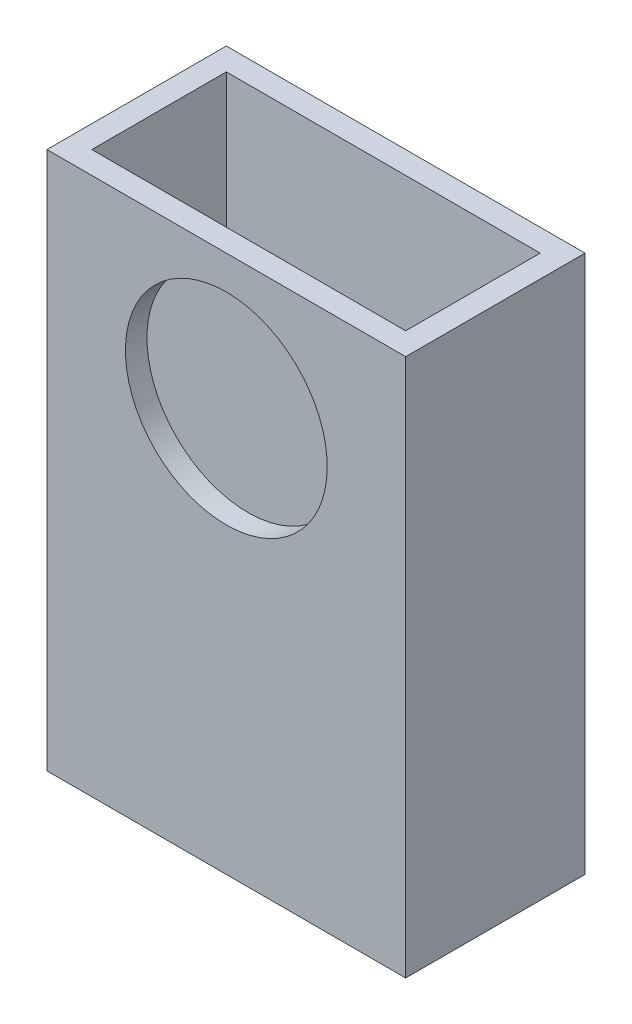
ISO-10303-21;
HEADER;
FILE_DESCRIPTION(('STEP AP214'),'2;1');
FILE_NAME('part.step','',(''),(''),'','','');
FILE_SCHEMA(('AUTOMOTIVE_DESIGN { 1 0 10303 214 1 1 1 1 }'));
ENDSEC;
DATA;
#1=APPLICATION_CONTEXT('core data for automotive mechanical design processes');
#2=APPLICATION_PROTOCOL_DEFINITION('international standard','automotive_design',2000,#1);
#3=PRODUCT_CONTEXT('',#1,'mechanical');
#4=PRODUCT('Part','Part','',(#3));
#5=PRODUCT_RELATED_PRODUCT_CATEGORY('part','',(#4));
#6=PRODUCT_DEFINITION_FORMATION('','',#4);
#7=PRODUCT_DEFINITION_CONTEXT('part definition',#1,'design');
#8=PRODUCT_DEFINITION('design','',#6,#7);
#9=PRODUCT_DEFINITION_SHAPE('','',#8);
#10=(LENGTH_UNIT() NAMED_UNIT(*) SI_UNIT(.MILLI.,.METRE.));
#11=(NAMED_UNIT(*) PLANE_ANGLE_UNIT() SI_UNIT($,.RADIAN.));
#12=(NAMED_UNIT(*) SI_UNIT($,.STERADIAN.) SOLID_ANGLE_UNIT());
#13=UNCERTAINTY_MEASURE_WITH_UNIT(LENGTH_MEASURE(1.E-05),#10,'distance_accuracy_value','');
#14=(GEOMETRIC_REPRESENTATION_CONTEXT(3) GLOBAL_UNCERTAINTY_ASSIGNED_CONTEXT((#13)) GLOBAL_UNIT_ASSIGNED_CONTEXT((#10,
#11,#12)) REPRESENTATION_CONTEXT('',''));
#15=CARTESIAN_POINT('',(0.,0.,0.));
#16=DIRECTION('',(0.,0.,1.));
#17=DIRECTION('',(1.,0.,0.));
#18=AXIS2_PLACEMENT_3D('',#15,#16,#17);
#19=CARTESIAN_POINT('',(0.,0.,25.4));
#20=DIRECTION('',(1.,0.,0.));
#21=DIRECTION('',(0.,1.,0.));
#22=AXIS2_PLACEMENT_3D('',#19,#20,#21);
#23=PLANE('',#22);
#24=DIRECTION('',(0.,-1.,0.));
#25=VECTOR('',#24,1.);
#26=CARTESIAN_POINT('',(0.,0.,0.));
#27=LINE('',#26,#25);
#28=CARTESIAN_POINT('',(0.,76.2,0.));
#29=VERTEX_POINT('',#28);
#30=CARTESIAN_POINT('',(0.,0.,0.));
#31=VERTEX_POINT('',#30);
#32=EDGE_CURVE('E151',#29,#31,#27,.T.);
#33=ORIENTED_EDGE('',*,*,#32,.T.);
#34=DIRECTION('',(0.,0.,-1.));
#35=VECTOR('',#34,1.);
#36=CARTESIAN_POINT('',(0.,0.,25.4));
#37=LINE('',#36,#35);
#38=CARTESIAN_POINT('',(0.,0.,25.4));
#39=VERTEX_POINT('',#38);
#40=EDGE_CURVE('E11',#39,#31,#37,.T.);
#41=ORIENTED_EDGE('',*,*,#40,.F.);
#42=DIRECTION('',(0.,-1.,0.));
#43=VECTOR('',#42,1.);
#44=CARTESIAN_POINT('',(0.,0.,25.4));
#45=LINE('',#44,#43);
#46=CARTESIAN_POINT('',(0.,76.2,25.4));
#47=VERTEX_POINT('',#46);
#48=EDGE_CURVE('E157',#47,#39,#45,.T.);
#49=ORIENTED_EDGE('',*,*,#48,.F.);
#50=DIRECTION('',(0.,0.,-1.));
#51=VECTOR('',#50,1.);
#52=CARTESIAN_POINT('',(0.,76.2,25.4));
#53=LINE('',#52,#51);
#54=EDGE_CURVE('E171',#47,#29,#53,.T.);
#55=ORIENTED_EDGE('',*,*,#54,.T.);
#56=EDGE_LOOP('',(#33,#41,#49,#55));
#57=FACE_BOUND('',#56,.T.);
#58=ADVANCED_FACE('F39',(#57),#23,.F.);
#59=CARTESIAN_POINT('',(0.,0.,25.4));
#60=DIRECTION('',(0.,1.,0.));
#61=DIRECTION('',(0.,0.,1.));
#62=AXIS2_PLACEMENT_3D('',#59,#60,#61);
#63=PLANE('',#62);
#64=DIRECTION('',(1.,0.,0.));
#65=VECTOR('',#64,1.);
#66=CARTESIAN_POINT('',(3.175,0.,3.175));
#67=LINE('',#66,#65);
#68=CARTESIAN_POINT('',(3.175,0.,3.175));
#69=VERTEX_POINT('',#68);
#70=CARTESIAN_POINT('',(47.625,0.,3.175));
#71=VERTEX_POINT('',#70);
#72=EDGE_CURVE('E141',#69,#71,#67,.T.);
#73=ORIENTED_EDGE('',*,*,#72,.F.);
#74=DIRECTION('',(0.,0.,-1.));
#75=VECTOR('',#74,1.);
#76=CARTESIAN_POINT('',(3.175,0.,22.225));
#77=LINE('',#76,#75);
#78=CARTESIAN_POINT('',(3.175,0.,22.225));
#79=VERTEX_POINT('',#78);
#80=EDGE_CURVE('E54',#79,#69,#77,.T.);
#81=ORIENTED_EDGE('',*,*,#80,.F.);
#82=DIRECTION('',(-1.,0.,0.));
#83=VECTOR('',#82,1.);
#84=CARTESIAN_POINT('',(3.175,0.,22.225));
#85=LINE('',#84,#83);
#86=CARTESIAN_POINT('',(47.625,0.,22.225));
#87=VERTEX_POINT('',#86);
#88=EDGE_CURVE('E125',#87,#79,#85,.T.);
#89=ORIENTED_EDGE('',*,*,#88,.F.);
#90=DIRECTION('',(0.,0.,1.));
#91=VECTOR('',#90,1.);
#92=CARTESIAN_POINT('',(47.625,0.,22.225));
#93=LINE('',#92,#91);
#94=EDGE_CURVE('E129',#71,#87,#93,.T.);
#95=ORIENTED_EDGE('',*,*,#94,.F.);
#96=EDGE_LOOP('',(#73,#81,#89,#95));
#97=FACE_BOUND('',#96,.T.);
#98=DIRECTION('',(1.,0.,0.));
#99=VECTOR('',#98,1.);
#100=CARTESIAN_POINT('',(0.,0.,0.));
#101=LINE('',#100,#99);
#102=CARTESIAN_POINT('',(50.8,0.,0.));
#103=VERTEX_POINT('',#102);
#104=EDGE_CURVE('E175',#31,#103,#101,.T.);
#105=ORIENTED_EDGE('',*,*,#104,.T.);
#106=DIRECTION('',(0.,0.,-1.));
#107=VECTOR('',#106,1.);
#108=CARTESIAN_POINT('',(50.8,0.,25.4));
#109=LINE('',#108,#107);
#110=CARTESIAN_POINT('',(50.8,0.,25.4));
#111=VERTEX_POINT('',#110);
#112=EDGE_CURVE('E47',#111,#103,#109,.T.);
#113=ORIENTED_EDGE('',*,*,#112,.F.);
#114=DIRECTION('',(1.,0.,0.));
#115=VECTOR('',#114,1.);
#116=CARTESIAN_POINT('',(0.,0.,25.4));
#117=LINE('',#116,#115);
#118=EDGE_CURVE('E161',#39,#111,#117,.T.);
#119=ORIENTED_EDGE('',*,*,#118,.F.);
#120=ORIENTED_EDGE('',*,*,#40,.T.);
#121=EDGE_LOOP('',(#105,#113,#119,#120));
#122=FACE_BOUND('',#121,.T.);
#123=ADVANCED_FACE('F209',(#97,#122),#63,.F.);
#124=CARTESIAN_POINT('',(50.8,0.,25.4));
#125=DIRECTION('',(-1.,0.,0.));
#126=DIRECTION('',(0.,-1.,0.));
#127=AXIS2_PLACEMENT_3D('',#124,#125,#126);
#128=PLANE('',#127);
#129=DIRECTION('',(0.,1.,0.));
#130=VECTOR('',#129,1.);
#131=CARTESIAN_POINT('',(50.8,0.,0.));
#132=LINE('',#131,#130);
#133=CARTESIAN_POINT('',(50.8,76.2,0.));
#134=VERTEX_POINT('',#133);
#135=EDGE_CURVE('E178',#103,#134,#132,.T.);
#136=ORIENTED_EDGE('',*,*,#135,.T.);
#137=DIRECTION('',(0.,0.,-1.));
#138=VECTOR('',#137,1.);
#139=CARTESIAN_POINT('',(50.8,76.2,25.4));
#140=LINE('',#139,#138);
#141=CARTESIAN_POINT('',(50.8,76.2,25.4));
#142=VERTEX_POINT('',#141);
#143=EDGE_CURVE('E186',#142,#134,#140,.T.);
#144=ORIENTED_EDGE('',*,*,#143,.F.);
#145=DIRECTION('',(0.,1.,0.));
#146=VECTOR('',#145,1.);
#147=CARTESIAN_POINT('',(50.8,0.,25.4));
#148=LINE('',#147,#146);
#149=EDGE_CURVE('E165',#111,#142,#148,.T.);
#150=ORIENTED_EDGE('',*,*,#149,.F.);
#151=ORIENTED_EDGE('',*,*,#112,.T.);
#152=EDGE_LOOP('',(#136,#144,#150,#151));
#153=FACE_BOUND('',#152,.T.);
#154=ADVANCED_FACE('F195',(#153),#128,.F.);
#155=CARTESIAN_POINT('',(0.,76.2,25.4));
#156=DIRECTION('',(0.,-1.,0.));
#157=DIRECTION('',(0.,0.,-1.));
#158=AXIS2_PLACEMENT_3D('',#155,#156,#157);
#159=PLANE('',#158);
#160=DIRECTION('',(-1.,0.,0.));
#161=VECTOR('',#160,1.);
#162=CARTESIAN_POINT('',(3.175,76.2,22.225));
#163=LINE('',#162,#161);
#164=CARTESIAN_POINT('',(47.625,76.2,22.225));
#165=VERTEX_POINT('',#164);
#166=CARTESIAN_POINT('',(3.175,76.2,22.225));
#167=VERTEX_POINT('',#166);
#168=EDGE_CURVE('E113',#165,#167,#163,.T.);
#169=ORIENTED_EDGE('',*,*,#168,.T.);
#170=DIRECTION('',(0.,0.,-1.));
#171=VECTOR('',#170,1.);
#172=CARTESIAN_POINT('',(3.175,76.2,22.225));
#173=LINE('',#172,#171);
#174=CARTESIAN_POINT('',(3.175,76.2,3.175));
#175=VERTEX_POINT('',#174);
#176=EDGE_CURVE('E106',#167,#175,#173,.T.);
#177=ORIENTED_EDGE('',*,*,#176,.T.);
#178=DIRECTION('',(1.,0.,0.));
#179=VECTOR('',#178,1.);
#180=CARTESIAN_POINT('',(3.175,76.2,3.175));
#181=LINE('',#180,#179);
#182=CARTESIAN_POINT('',(47.625,76.2,3.175));
#183=VERTEX_POINT('',#182);
#184=EDGE_CURVE('E116',#175,#183,#181,.T.);
#185=ORIENTED_EDGE('',*,*,#184,.T.);
#186=DIRECTION('',(0.,0.,1.));
#187=VECTOR('',#186,1.);
#188=CARTESIAN_POINT('',(47.625,76.2,22.225));
#189=LINE('',#188,#187);
#190=EDGE_CURVE('E62',#183,#165,#189,.T.);
#191=ORIENTED_EDGE('',*,*,#190,.T.);
#192=EDGE_LOOP('',(#169,#177,#185,#191));
#193=FACE_BOUND('',#192,.T.);
#194=DIRECTION('',(-1.,0.,0.));
#195=VECTOR('',#194,1.);
#196=CARTESIAN_POINT('',(0.,76.2,0.));
#197=LINE('',#196,#195);
#198=EDGE_CURVE('E162',#134,#29,#197,.T.);
#199=ORIENTED_EDGE('',*,*,#198,.T.);
#200=ORIENTED_EDGE('',*,*,#54,.F.);
#201=DIRECTION('',(-1.,0.,0.));
#202=VECTOR('',#201,1.);
#203=CARTESIAN_POINT('',(0.,76.2,25.4));
#204=LINE('',#203,#202);
#205=EDGE_CURVE('E168',#142,#47,#204,.T.);
#206=ORIENTED_EDGE('',*,*,#205,.F.);
#207=ORIENTED_EDGE('',*,*,#143,.T.);
#208=EDGE_LOOP('',(#199,#200,#206,#207));
#209=FACE_BOUND('',#208,.T.);
#210=ADVANCED_FACE('F121',(#193,#209),#159,.F.);
#211=CARTESIAN_POINT('',(0.,0.,25.4));
#212=DIRECTION('',(0.,0.,-1.));
#213=DIRECTION('',(-1.,0.,0.));
#214=AXIS2_PLACEMENT_3D('',#211,#212,#213);
#215=PLANE('',#214);
#216=CARTESIAN_POINT('',(25.4,57.15,25.4));
#217=DIRECTION('',(0.,0.,1.));
#218=DIRECTION('',(1.,0.,0.));
#219=AXIS2_PLACEMENT_3D('',#216,#217,#218);
#220=CIRCLE('',#219,14.2875);
#221=CARTESIAN_POINT('',(39.6875,57.15,25.4));
#222=VERTEX_POINT('',#221);
#223=EDGE_CURVE('E132',#222,#222,#220,.T.);
#224=ORIENTED_EDGE('',*,*,#223,.F.);
#225=EDGE_LOOP('',(#224));
#226=FACE_BOUND('',#225,.T.);
#227=ORIENTED_EDGE('',*,*,#48,.T.);
#228=ORIENTED_EDGE('',*,*,#118,.T.);
#229=ORIENTED_EDGE('',*,*,#149,.T.);
#230=ORIENTED_EDGE('',*,*,#205,.T.);
#231=EDGE_LOOP('',(#227,#228,#229,#230));
#232=FACE_BOUND('',#231,.T.);
#233=ADVANCED_FACE('F208',(#226,#232),#215,.F.);
#234=CARTESIAN_POINT('',(0.,0.,0.));
#235=DIRECTION('',(0.,0.,-1.));
#236=DIRECTION('',(-1.,0.,0.));
#237=AXIS2_PLACEMENT_3D('',#234,#235,#236);
#238=PLANE('',#237);
#239=ORIENTED_EDGE('',*,*,#32,.F.);
#240=ORIENTED_EDGE('',*,*,#198,.F.);
#241=ORIENTED_EDGE('',*,*,#135,.F.);
#242=ORIENTED_EDGE('',*,*,#104,.F.);
#243=EDGE_LOOP('',(#239,#240,#241,#242));
#244=FACE_BOUND('',#243,.T.);
#245=ADVANCED_FACE('F201',(#244),#238,.T.);
#246=CARTESIAN_POINT('',(3.175,76.2,22.225));
#247=DIRECTION('',(-1.,0.,0.));
#248=DIRECTION('',(0.,0.,1.));
#249=AXIS2_PLACEMENT_3D('',#246,#247,#248);
#250=PLANE('',#249);
#251=ORIENTED_EDGE('',*,*,#80,.T.);
#252=DIRECTION('',(0.,-1.,0.));
#253=VECTOR('',#252,1.);
#254=CARTESIAN_POINT('',(3.175,76.2,3.175));
#255=LINE('',#254,#253);
#256=EDGE_CURVE('E102',#175,#69,#255,.T.);
#257=ORIENTED_EDGE('',*,*,#256,.F.);
#258=ORIENTED_EDGE('',*,*,#176,.F.);
#259=DIRECTION('',(0.,-1.,0.));
#260=VECTOR('',#259,1.);
#261=CARTESIAN_POINT('',(3.175,76.2,22.225));
#262=LINE('',#261,#260);
#263=EDGE_CURVE('E148',#167,#79,#262,.T.);
#264=ORIENTED_EDGE('',*,*,#263,.T.);
#265=EDGE_LOOP('',(#251,#257,#258,#264));
#266=FACE_BOUND('',#265,.T.);
#267=ADVANCED_FACE('F104',(#266),#250,.F.);
#268=CARTESIAN_POINT('',(3.175,76.2,22.225));
#269=DIRECTION('',(0.,0.,1.));
#270=DIRECTION('',(1.,0.,0.));
#271=AXIS2_PLACEMENT_3D('',#268,#269,#270);
#272=PLANE('',#271);
#273=ORIENTED_EDGE('',*,*,#88,.T.);
#274=ORIENTED_EDGE('',*,*,#263,.F.);
#275=ORIENTED_EDGE('',*,*,#168,.F.);
#276=DIRECTION('',(0.,-1.,0.));
#277=VECTOR('',#276,1.);
#278=CARTESIAN_POINT('',(47.625,76.2,22.225));
#279=LINE('',#278,#277);
#280=EDGE_CURVE('E152',#165,#87,#279,.T.);
#281=ORIENTED_EDGE('',*,*,#280,.T.);
#282=EDGE_LOOP('',(#273,#274,#275,#281));
#283=FACE_BOUND('',#282,.T.);
#284=ADVANCED_FACE('F227',(#283),#272,.F.);
#285=CARTESIAN_POINT('',(47.625,76.2,22.225));
#286=DIRECTION('',(1.,0.,0.));
#287=DIRECTION('',(0.,0.,-1.));
#288=AXIS2_PLACEMENT_3D('',#285,#286,#287);
#289=PLANE('',#288);
#290=ORIENTED_EDGE('',*,*,#94,.T.);
#291=ORIENTED_EDGE('',*,*,#280,.F.);
#292=ORIENTED_EDGE('',*,*,#190,.F.);
#293=DIRECTION('',(0.,-1.,0.));
#294=VECTOR('',#293,1.);
#295=CARTESIAN_POINT('',(47.625,76.2,3.175));
#296=LINE('',#295,#294);
#297=EDGE_CURVE('E112',#183,#71,#296,.T.);
#298=ORIENTED_EDGE('',*,*,#297,.T.);
#299=EDGE_LOOP('',(#290,#291,#292,#298));
#300=FACE_BOUND('',#299,.T.);
#301=ADVANCED_FACE('F231',(#300),#289,.F.);
#302=CARTESIAN_POINT('',(3.175,76.2,3.175));
#303=DIRECTION('',(0.,0.,-1.));
#304=DIRECTION('',(-1.,0.,0.));
#305=AXIS2_PLACEMENT_3D('',#302,#303,#304);
#306=PLANE('',#305);
#307=ORIENTED_EDGE('',*,*,#72,.T.);
#308=ORIENTED_EDGE('',*,*,#297,.F.);
#309=ORIENTED_EDGE('',*,*,#184,.F.);
#310=ORIENTED_EDGE('',*,*,#256,.T.);
#311=EDGE_LOOP('',(#307,#308,#309,#310));
#312=FACE_BOUND('',#311,.T.);
#313=ADVANCED_FACE('F117',(#312),#306,.F.);
#314=CARTESIAN_POINT('',(25.4,57.15,22.352));
#315=DIRECTION('',(0.,0.,1.));
#316=DIRECTION('',(1.,0.,0.));
#317=AXIS2_PLACEMENT_3D('',#314,#315,#316);
#318=CYLINDRICAL_SURFACE('',#317,14.2875);
#319=CARTESIAN_POINT('',(25.4,57.15,22.352));
#320=DIRECTION('',(0.,0.,1.));
#321=DIRECTION('',(1.,0.,0.));
#322=AXIS2_PLACEMENT_3D('',#319,#320,#321);
#323=CIRCLE('',#322,14.2875);
#324=CARTESIAN_POINT('',(39.6875,57.15,22.352));
#325=VERTEX_POINT('',#324);
#326=EDGE_CURVE('E142',#325,#325,#323,.T.);
#327=CARTESIAN_POINT('',(39.6875,57.15,22.352));
#328=CARTESIAN_POINT('',(39.6875,57.15,22.38375));
#329=CARTESIAN_POINT('',(39.6875,57.15,22.4155));
#330=CARTESIAN_POINT('',(39.6875,57.15,22.479));
#331=CARTESIAN_POINT('',(39.6875,57.15,22.51075));
#332=CARTESIAN_POINT('',(39.6875,57.15,22.57425));
#333=CARTESIAN_POINT('',(39.6875,57.15,22.606));
#334=CARTESIAN_POINT('',(39.6875,57.15,22.6695));
#335=CARTESIAN_POINT('',(39.6875,57.15,22.70125));
#336=CARTESIAN_POINT('',(39.6875,57.15,22.76475));
#337=CARTESIAN_POINT('',(39.6875,57.15,22.7965));
#338=CARTESIAN_POINT('',(39.6875,57.15,22.86));
#339=CARTESIAN_POINT('',(39.6875,57.15,22.89175));
#340=CARTESIAN_POINT('',(39.6875,57.15,22.95525));
#341=CARTESIAN_POINT('',(39.6875,57.15,22.987));
#342=CARTESIAN_POINT('',(39.6875,57.15,23.0505));
#343=CARTESIAN_POINT('',(39.6875,57.15,23.08225));
#344=CARTESIAN_POINT('',(39.6875,57.15,23.14575));
#345=CARTESIAN_POINT('',(39.6875,57.15,23.1775));
#346=CARTESIAN_POINT('',(39.6875,57.15,23.241));
#347=CARTESIAN_POINT('',(39.6875,57.15,23.27275));
#348=CARTESIAN_POINT('',(39.6875,57.15,23.33625));
#349=CARTESIAN_POINT('',(39.6875,57.15,23.368));
#350=CARTESIAN_POINT('',(39.6875,57.15,23.4315));
#351=CARTESIAN_POINT('',(39.6875,57.15,23.46325));
#352=CARTESIAN_POINT('',(39.6875,57.15,23.52675));
#353=CARTESIAN_POINT('',(39.6875,57.15,23.5585));
#354=CARTESIAN_POINT('',(39.6875,57.15,23.622));
#355=CARTESIAN_POINT('',(39.6875,57.15,23.65375));
#356=CARTESIAN_POINT('',(39.6875,57.15,23.71725));
#357=CARTESIAN_POINT('',(39.6875,57.15,23.749));
#358=CARTESIAN_POINT('',(39.6875,57.15,23.8125));
#359=CARTESIAN_POINT('',(39.6875,57.15,23.84425));
#360=CARTESIAN_POINT('',(39.6875,57.15,23.90775));
#361=CARTESIAN_POINT('',(39.6875,57.15,23.9395));
#362=CARTESIAN_POINT('',(39.6875,57.15,24.003));
#363=CARTESIAN_POINT('',(39.6875,57.15,24.03475));
#364=CARTESIAN_POINT('',(39.6875,57.15,24.09825));
#365=CARTESIAN_POINT('',(39.6875,57.15,24.13));
#366=CARTESIAN_POINT('',(39.6875,57.15,24.1935));
#367=CARTESIAN_POINT('',(39.6875,57.15,24.22525));
#368=CARTESIAN_POINT('',(39.6875,57.15,24.28875));
#369=CARTESIAN_POINT('',(39.6875,57.15,24.3205));
#370=CARTESIAN_POINT('',(39.6875,57.15,24.384));
#371=CARTESIAN_POINT('',(39.6875,57.15,24.41575));
#372=CARTESIAN_POINT('',(39.6875,57.15,24.47925));
#373=CARTESIAN_POINT('',(39.6875,57.15,24.511));
#374=CARTESIAN_POINT('',(39.6875,57.15,24.5745));
#375=CARTESIAN_POINT('',(39.6875,57.15,24.60625));
#376=CARTESIAN_POINT('',(39.6875,57.15,24.66975));
#377=CARTESIAN_POINT('',(39.6875,57.15,24.7015));
#378=CARTESIAN_POINT('',(39.6875,57.15,24.765));
#379=CARTESIAN_POINT('',(39.6875,57.15,24.79675));
#380=CARTESIAN_POINT('',(39.6875,57.15,24.86025));
#381=CARTESIAN_POINT('',(39.6875,57.15,24.892));
#382=CARTESIAN_POINT('',(39.6875,57.15,24.9555));
#383=CARTESIAN_POINT('',(39.6875,57.15,24.98725));
#384=CARTESIAN_POINT('',(39.6875,57.15,25.05075));
#385=CARTESIAN_POINT('',(39.6875,57.15,25.0825));
#386=CARTESIAN_POINT('',(39.6875,57.15,25.146));
#387=CARTESIAN_POINT('',(39.6875,57.15,25.17775));
#388=CARTESIAN_POINT('',(39.6875,57.15,25.24125));
#389=CARTESIAN_POINT('',(39.6875,57.15,25.273));
#390=CARTESIAN_POINT('',(39.6875,57.15,25.3365));
#391=CARTESIAN_POINT('',(39.6875,57.15,25.36825));
#392=CARTESIAN_POINT('',(39.6875,57.15,25.4));
#393=B_SPLINE_CURVE_WITH_KNOTS('',3,(#327,#328,#329,#330,#331,#332,#333,#334,#335,#336,#337,
#338,#339,#340,#341,#342,#343,#344,#345,#346,#347,#348,#349,#350,#351,#352,#353,#354,#355,#356,
#357,#358,#359,#360,#361,#362,#363,#364,#365,#366,#367,#368,#369,#370,#371,#372,#373,#374,#375,
#376,#377,#378,#379,#380,#381,#382,#383,#384,#385,#386,#387,#388,#389,#390,#391,#392),
.UNSPECIFIED.,.F.,.F.,(4,2,2,2,2,2,2,2,2,2,2,2,2,2,2,2,2,2,2,2,2,2,2,2,2,2,2,2,2,2,2,2,4),(0.,
0.0952499999999981,0.1905,0.285749999999998,0.380999999999999,0.476249999999998,
0.571499999999999,0.666749999999997,0.761999999999999,0.857249999999997,0.952499999999998,
1.04775,1.143,1.23825,1.3335,1.42875,1.524,1.61925,1.7145,1.80975,1.905,2.00025,2.0955,2.19075,
2.286,2.38125,2.4765,2.57175,2.667,2.76225,2.8575,2.95275,3.048),.UNSPECIFIED.);
#394=EDGE_CURVE('BSEAM230',#325,#222,#393,.T.);
#395=ORIENTED_EDGE('',*,*,#326,.F.);
#396=ORIENTED_EDGE('',*,*,#223,.T.);
#397=ORIENTED_EDGE('',*,*,#394,.T.);
#398=ORIENTED_EDGE('',*,*,#394,.F.);
#399=EDGE_LOOP('',(#395,#397,#396,#398));
#400=FACE_BOUND('',#399,.T.);
#401=ADVANCED_FACE('F230',(#400),#318,.F.);
#402=CARTESIAN_POINT('',(25.4,57.15,22.352));
#403=DIRECTION('',(0.,0.,1.));
#404=DIRECTION('',(1.,0.,0.));
#405=AXIS2_PLACEMENT_3D('',#402,#403,#404);
#406=PLANE('',#405);
#407=ORIENTED_EDGE('',*,*,#326,.T.);
#408=EDGE_LOOP('',(#407));
#409=FACE_BOUND('',#408,.T.);
#410=ADVANCED_FACE('F239',(#409),#406,.T.);
#411=CLOSED_SHELL('',(#58,#123,#154,#210,#233,#245,#267,#284,#301,#313,#401,#410));
#412=MANIFOLD_SOLID_BREP('B2',#411);
#413=ADVANCED_BREP_SHAPE_REPRESENTATION('',(#18,#412),#14);
#414=SHAPE_DEFINITION_REPRESENTATION(#9,#413);
ENDSEC;
END-ISO-10303-21;
